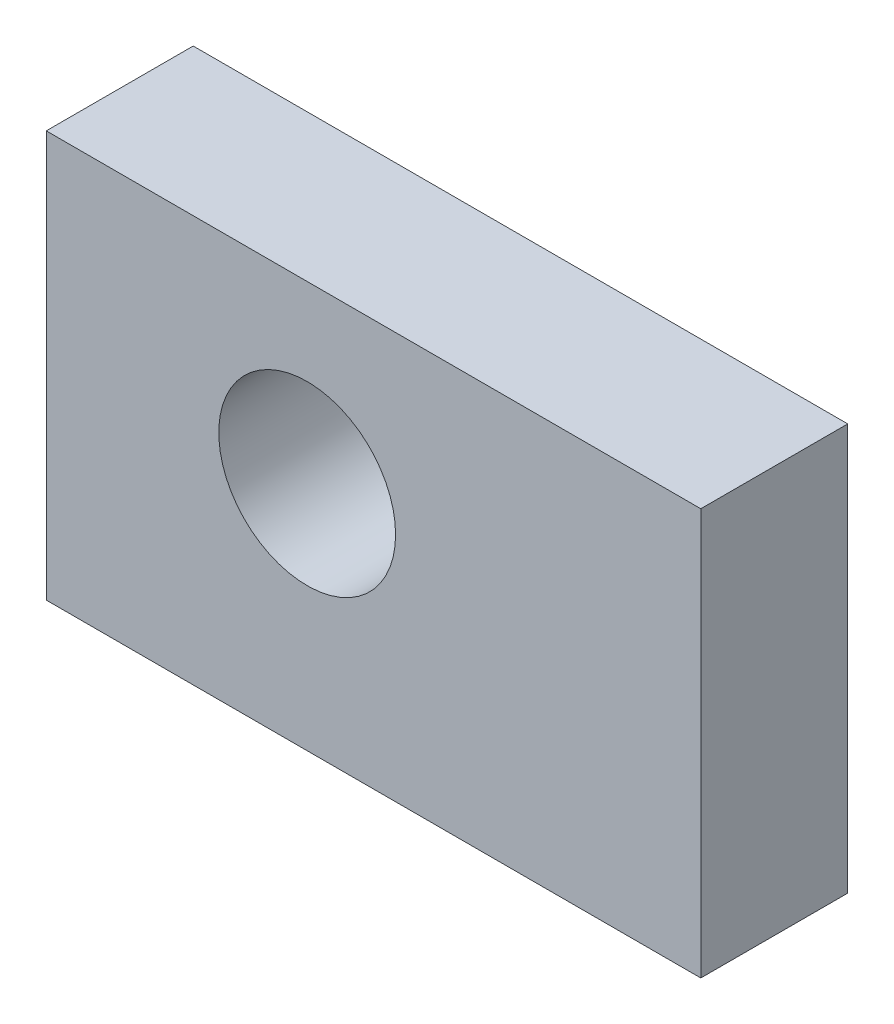
ISO-10303-21;
HEADER;
FILE_DESCRIPTION(('STEP AP214'),'2;1');
FILE_NAME('part.step','',(''),(''),'','','');
FILE_SCHEMA(('AUTOMOTIVE_DESIGN { 1 0 10303 214 1 1 1 1 }'));
ENDSEC;
DATA;
#1=APPLICATION_CONTEXT('core data for automotive mechanical design processes');
#2=APPLICATION_PROTOCOL_DEFINITION('international standard','automotive_design',2000,#1);
#3=PRODUCT_CONTEXT('',#1,'mechanical');
#4=PRODUCT('Part','Part','',(#3));
#5=PRODUCT_RELATED_PRODUCT_CATEGORY('part','',(#4));
#6=PRODUCT_DEFINITION_FORMATION('','',#4);
#7=PRODUCT_DEFINITION_CONTEXT('part definition',#1,'design');
#8=PRODUCT_DEFINITION('design','',#6,#7);
#9=PRODUCT_DEFINITION_SHAPE('','',#8);
#10=(LENGTH_UNIT() NAMED_UNIT(*) SI_UNIT(.MILLI.,.METRE.));
#11=(NAMED_UNIT(*) PLANE_ANGLE_UNIT() SI_UNIT($,.RADIAN.));
#12=(NAMED_UNIT(*) SI_UNIT($,.STERADIAN.) SOLID_ANGLE_UNIT());
#13=UNCERTAINTY_MEASURE_WITH_UNIT(LENGTH_MEASURE(1.E-05),#10,'distance_accuracy_value','');
#14=(GEOMETRIC_REPRESENTATION_CONTEXT(3) GLOBAL_UNCERTAINTY_ASSIGNED_CONTEXT((#13)) GLOBAL_UNIT_ASSIGNED_CONTEXT((#10,
#11,#12)) REPRESENTATION_CONTEXT('',''));
#15=CARTESIAN_POINT('',(0.,0.,0.));
#16=DIRECTION('',(0.,0.,1.));
#17=DIRECTION('',(1.,0.,0.));
#18=AXIS2_PLACEMENT_3D('',#15,#16,#17);
#19=CARTESIAN_POINT('',(0.,0.,10.));
#20=DIRECTION('',(1.,0.,0.));
#21=DIRECTION('',(0.,0.,-1.));
#22=AXIS2_PLACEMENT_3D('',#19,#20,#21);
#23=PLANE('',#22);
#24=DIRECTION('',(0.,-1.,0.));
#25=VECTOR('',#24,1.);
#26=CARTESIAN_POINT('',(0.,0.,0.));
#27=LINE('',#26,#25);
#28=CARTESIAN_POINT('',(0.,27.654606741573,0.));
#29=VERTEX_POINT('',#28);
#30=CARTESIAN_POINT('',(0.,0.,0.));
#31=VERTEX_POINT('',#30);
#32=EDGE_CURVE('E100',#29,#31,#27,.T.);
#33=ORIENTED_EDGE('',*,*,#32,.T.);
#34=DIRECTION('',(0.,0.,-1.));
#35=VECTOR('',#34,1.);
#36=CARTESIAN_POINT('',(0.,0.,10.));
#37=LINE('',#36,#35);
#38=CARTESIAN_POINT('',(0.,0.,10.));
#39=VERTEX_POINT('',#38);
#40=EDGE_CURVE('E11',#39,#31,#37,.T.);
#41=ORIENTED_EDGE('',*,*,#40,.F.);
#42=DIRECTION('',(0.,-1.,0.));
#43=VECTOR('',#42,1.);
#44=CARTESIAN_POINT('',(0.,0.,10.));
#45=LINE('',#44,#43);
#46=CARTESIAN_POINT('',(0.,27.654606741573,10.));
#47=VERTEX_POINT('',#46);
#48=EDGE_CURVE('E88',#47,#39,#45,.T.);
#49=ORIENTED_EDGE('',*,*,#48,.F.);
#50=DIRECTION('',(0.,0.,-1.));
#51=VECTOR('',#50,1.);
#52=CARTESIAN_POINT('',(0.,27.654606741573,10.));
#53=LINE('',#52,#51);
#54=EDGE_CURVE('E96',#47,#29,#53,.T.);
#55=ORIENTED_EDGE('',*,*,#54,.T.);
#56=EDGE_LOOP('',(#33,#41,#49,#55));
#57=FACE_BOUND('',#56,.T.);
#58=ADVANCED_FACE('F37',(#57),#23,.F.);
#59=CARTESIAN_POINT('',(0.,0.,10.));
#60=DIRECTION('',(0.,1.,0.));
#61=DIRECTION('',(0.,0.,1.));
#62=AXIS2_PLACEMENT_3D('',#59,#60,#61);
#63=PLANE('',#62);
#64=DIRECTION('',(1.,0.,0.));
#65=VECTOR('',#64,1.);
#66=CARTESIAN_POINT('',(0.,0.,0.));
#67=LINE('',#66,#65);
#68=CARTESIAN_POINT('',(44.5396435575179,0.,0.));
#69=VERTEX_POINT('',#68);
#70=EDGE_CURVE('E92',#31,#69,#67,.T.);
#71=ORIENTED_EDGE('',*,*,#70,.T.);
#72=DIRECTION('',(0.,0.,-1.));
#73=VECTOR('',#72,1.);
#74=CARTESIAN_POINT('',(44.5396435575179,0.,10.));
#75=LINE('',#74,#73);
#76=CARTESIAN_POINT('',(44.5396435575179,0.,10.));
#77=VERTEX_POINT('',#76);
#78=EDGE_CURVE('E45',#77,#69,#75,.T.);
#79=ORIENTED_EDGE('',*,*,#78,.F.);
#80=DIRECTION('',(1.,0.,0.));
#81=VECTOR('',#80,1.);
#82=CARTESIAN_POINT('',(0.,0.,10.));
#83=LINE('',#82,#81);
#84=EDGE_CURVE('E83',#39,#77,#83,.T.);
#85=ORIENTED_EDGE('',*,*,#84,.F.);
#86=ORIENTED_EDGE('',*,*,#40,.T.);
#87=EDGE_LOOP('',(#71,#79,#85,#86));
#88=FACE_BOUND('',#87,.T.);
#89=ADVANCED_FACE('F91',(#88),#63,.F.);
#90=CARTESIAN_POINT('',(44.5396435575179,0.,10.));
#91=DIRECTION('',(-1.,0.,0.));
#92=DIRECTION('',(0.,0.,1.));
#93=AXIS2_PLACEMENT_3D('',#90,#91,#92);
#94=PLANE('',#93);
#95=DIRECTION('',(0.,1.,0.));
#96=VECTOR('',#95,1.);
#97=CARTESIAN_POINT('',(44.5396435575179,0.,0.));
#98=LINE('',#97,#96);
#99=CARTESIAN_POINT('',(44.5396435575179,27.654606741573,0.));
#100=VERTEX_POINT('',#99);
#101=EDGE_CURVE('E70',#69,#100,#98,.T.);
#102=ORIENTED_EDGE('',*,*,#101,.T.);
#103=DIRECTION('',(0.,0.,-1.));
#104=VECTOR('',#103,1.);
#105=CARTESIAN_POINT('',(44.5396435575179,27.654606741573,10.));
#106=LINE('',#105,#104);
#107=CARTESIAN_POINT('',(44.5396435575179,27.654606741573,10.));
#108=VERTEX_POINT('',#107);
#109=EDGE_CURVE('E93',#108,#100,#106,.T.);
#110=ORIENTED_EDGE('',*,*,#109,.F.);
#111=DIRECTION('',(0.,1.,0.));
#112=VECTOR('',#111,1.);
#113=CARTESIAN_POINT('',(44.5396435575179,0.,10.));
#114=LINE('',#113,#112);
#115=EDGE_CURVE('E86',#77,#108,#114,.T.);
#116=ORIENTED_EDGE('',*,*,#115,.F.);
#117=ORIENTED_EDGE('',*,*,#78,.T.);
#118=EDGE_LOOP('',(#102,#110,#116,#117));
#119=FACE_BOUND('',#118,.T.);
#120=ADVANCED_FACE('F94',(#119),#94,.F.);
#121=CARTESIAN_POINT('',(0.,27.654606741573,10.));
#122=DIRECTION('',(0.,-1.,0.));
#123=DIRECTION('',(0.,0.,-1.));
#124=AXIS2_PLACEMENT_3D('',#121,#122,#123);
#125=PLANE('',#124);
#126=DIRECTION('',(-1.,0.,0.));
#127=VECTOR('',#126,1.);
#128=CARTESIAN_POINT('',(0.,27.654606741573,0.));
#129=LINE('',#128,#127);
#130=EDGE_CURVE('E76',#100,#29,#129,.T.);
#131=ORIENTED_EDGE('',*,*,#130,.T.);
#132=ORIENTED_EDGE('',*,*,#54,.F.);
#133=DIRECTION('',(-1.,0.,0.));
#134=VECTOR('',#133,1.);
#135=CARTESIAN_POINT('',(0.,27.654606741573,10.));
#136=LINE('',#135,#134);
#137=EDGE_CURVE('E53',#108,#47,#136,.T.);
#138=ORIENTED_EDGE('',*,*,#137,.F.);
#139=ORIENTED_EDGE('',*,*,#109,.T.);
#140=EDGE_LOOP('',(#131,#132,#138,#139));
#141=FACE_BOUND('',#140,.T.);
#142=ADVANCED_FACE('F108',(#141),#125,.F.);
#143=CARTESIAN_POINT('',(0.,0.,10.));
#144=DIRECTION('',(0.,0.,-1.));
#145=DIRECTION('',(-1.,0.,0.));
#146=AXIS2_PLACEMENT_3D('',#143,#144,#145);
#147=PLANE('',#146);
#148=CARTESIAN_POINT('',(17.7550771208388,15.74449407142,10.));
#149=DIRECTION('',(0.,0.,1.));
#150=DIRECTION('',(1.,0.,0.));
#151=AXIS2_PLACEMENT_3D('',#148,#149,#150);
#152=CIRCLE('',#151,6.01626262719841);
#153=CARTESIAN_POINT('',(23.7713397480372,15.74449407142,10.));
#154=VERTEX_POINT('',#153);
#155=EDGE_CURVE('E114',#154,#154,#152,.T.);
#156=ORIENTED_EDGE('',*,*,#155,.F.);
#157=EDGE_LOOP('',(#156));
#158=FACE_BOUND('',#157,.T.);
#159=ORIENTED_EDGE('',*,*,#48,.T.);
#160=ORIENTED_EDGE('',*,*,#84,.T.);
#161=ORIENTED_EDGE('',*,*,#115,.T.);
#162=ORIENTED_EDGE('',*,*,#137,.T.);
#163=EDGE_LOOP('',(#159,#160,#161,#162));
#164=FACE_BOUND('',#163,.T.);
#165=ADVANCED_FACE('F84',(#158,#164),#147,.F.);
#166=CARTESIAN_POINT('',(0.,0.,0.));
#167=DIRECTION('',(0.,0.,-1.));
#168=DIRECTION('',(-1.,0.,0.));
#169=AXIS2_PLACEMENT_3D('',#166,#167,#168);
#170=PLANE('',#169);
#171=CARTESIAN_POINT('',(17.7550771208388,15.74449407142,0.));
#172=DIRECTION('',(0.,0.,1.));
#173=DIRECTION('',(1.,0.,0.));
#174=AXIS2_PLACEMENT_3D('',#171,#172,#173);
#175=CIRCLE('',#174,6.01626262719841);
#176=CARTESIAN_POINT('',(23.7713397480372,15.74449407142,0.));
#177=VERTEX_POINT('',#176);
#178=EDGE_CURVE('E103',#177,#177,#175,.T.);
#179=ORIENTED_EDGE('',*,*,#178,.T.);
#180=EDGE_LOOP('',(#179));
#181=FACE_BOUND('',#180,.T.);
#182=ORIENTED_EDGE('',*,*,#32,.F.);
#183=ORIENTED_EDGE('',*,*,#130,.F.);
#184=ORIENTED_EDGE('',*,*,#101,.F.);
#185=ORIENTED_EDGE('',*,*,#70,.F.);
#186=EDGE_LOOP('',(#182,#183,#184,#185));
#187=FACE_BOUND('',#186,.T.);
#188=ADVANCED_FACE('F111',(#181,#187),#170,.T.);
#189=CARTESIAN_POINT('',(17.7550771208388,15.74449407142,0.));
#190=DIRECTION('',(0.,0.,1.));
#191=DIRECTION('',(1.,0.,0.));
#192=AXIS2_PLACEMENT_3D('',#189,#190,#191);
#193=CYLINDRICAL_SURFACE('',#192,6.01626262719841);
#194=ORIENTED_EDGE('',*,*,#178,.F.);
#195=EDGE_LOOP('',(#194));
#196=FACE_BOUND('',#195,.T.);
#197=ORIENTED_EDGE('',*,*,#155,.T.);
#198=EDGE_LOOP('',(#197));
#199=FACE_BOUND('',#198,.T.);
#200=ADVANCED_FACE('F121',(#196,#199),#193,.F.);
#201=CLOSED_SHELL('',(#58,#89,#120,#142,#165,#188,#200));
#202=MANIFOLD_SOLID_BREP('B2',#201);
#203=ADVANCED_BREP_SHAPE_REPRESENTATION('',(#18,#202),#14);
#204=SHAPE_DEFINITION_REPRESENTATION(#9,#203);
ENDSEC;
END-ISO-10303-21;
